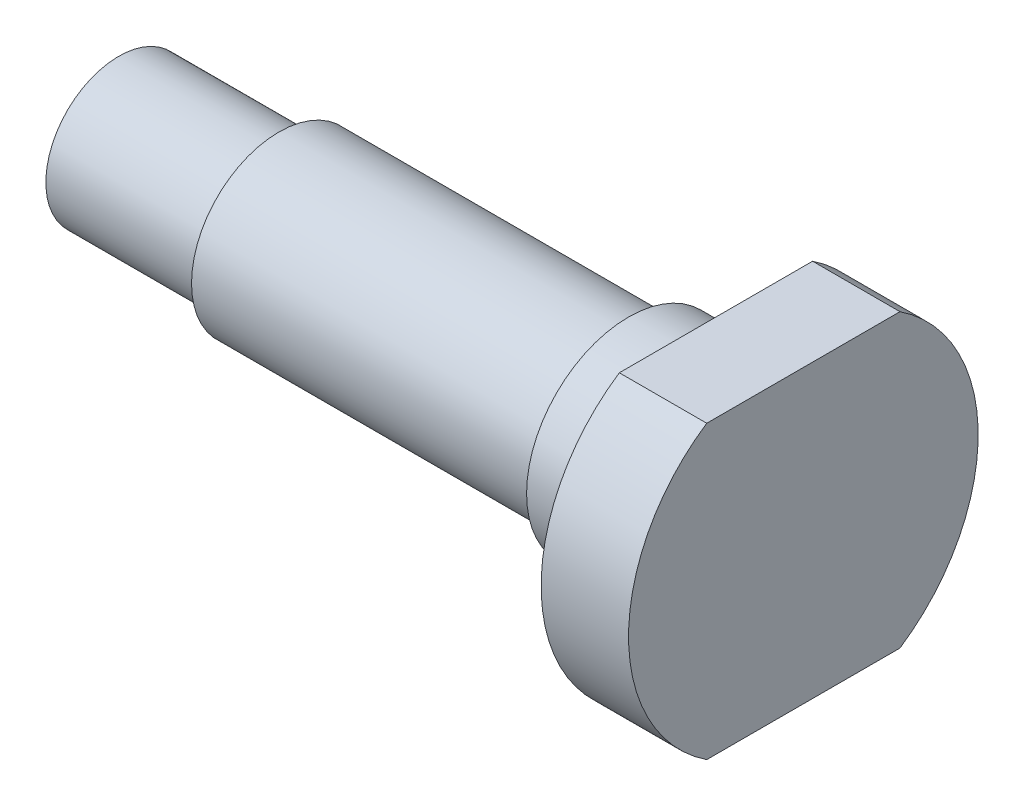
ISO-10303-21;
HEADER;
FILE_DESCRIPTION(('STEP AP214'),'2;1');
FILE_NAME('part.step','',(''),(''),'','','');
FILE_SCHEMA(('AUTOMOTIVE_DESIGN { 1 0 10303 214 1 1 1 1 }'));
ENDSEC;
DATA;
#1=APPLICATION_CONTEXT('core data for automotive mechanical design processes');
#2=APPLICATION_PROTOCOL_DEFINITION('international standard','automotive_design',2000,#1);
#3=PRODUCT_CONTEXT('',#1,'mechanical');
#4=PRODUCT('Part','Part','',(#3));
#5=PRODUCT_RELATED_PRODUCT_CATEGORY('part','',(#4));
#6=PRODUCT_DEFINITION_FORMATION('','',#4);
#7=PRODUCT_DEFINITION_CONTEXT('part definition',#1,'design');
#8=PRODUCT_DEFINITION('design','',#6,#7);
#9=PRODUCT_DEFINITION_SHAPE('','',#8);
#10=(LENGTH_UNIT() NAMED_UNIT(*) SI_UNIT(.MILLI.,.METRE.));
#11=(NAMED_UNIT(*) PLANE_ANGLE_UNIT() SI_UNIT($,.RADIAN.));
#12=(NAMED_UNIT(*) SI_UNIT($,.STERADIAN.) SOLID_ANGLE_UNIT());
#13=UNCERTAINTY_MEASURE_WITH_UNIT(LENGTH_MEASURE(1.E-05),#10,'distance_accuracy_value','');
#14=(GEOMETRIC_REPRESENTATION_CONTEXT(3) GLOBAL_UNCERTAINTY_ASSIGNED_CONTEXT((#13)) GLOBAL_UNIT_ASSIGNED_CONTEXT((#10,
#11,#12)) REPRESENTATION_CONTEXT('',''));
#15=CARTESIAN_POINT('',(0.,0.,0.));
#16=DIRECTION('',(0.,0.,1.));
#17=DIRECTION('',(1.,0.,0.));
#18=AXIS2_PLACEMENT_3D('',#15,#16,#17);
#19=CARTESIAN_POINT('',(-15.,0.,0.));
#20=DIRECTION('',(1.,0.,0.));
#21=DIRECTION('',(0.,0.,-1.));
#22=AXIS2_PLACEMENT_3D('',#19,#20,#21);
#23=CYLINDRICAL_SURFACE('',#22,3.);
#24=CARTESIAN_POINT('',(-15.,0.,0.));
#25=DIRECTION('',(1.,0.,0.));
#26=DIRECTION('',(0.,0.,-1.));
#27=AXIS2_PLACEMENT_3D('',#24,#25,#26);
#28=CIRCLE('',#27,3.);
#29=CARTESIAN_POINT('',(-15.,0.,-3.));
#30=VERTEX_POINT('',#29);
#31=EDGE_CURVE('E105',#30,#30,#28,.T.);
#32=ORIENTED_EDGE('',*,*,#31,.T.);
#33=EDGE_LOOP('',(#32));
#34=FACE_BOUND('',#33,.T.);
#35=CARTESIAN_POINT('',(-3.,0.,0.));
#36=DIRECTION('',(1.,0.,0.));
#37=DIRECTION('',(0.,0.,-1.));
#38=AXIS2_PLACEMENT_3D('',#35,#36,#37);
#39=CIRCLE('',#38,3.);
#40=CARTESIAN_POINT('',(-3.,0.,-3.));
#41=VERTEX_POINT('',#40);
#42=EDGE_CURVE('E176',#41,#41,#39,.T.);
#43=ORIENTED_EDGE('',*,*,#42,.F.);
#44=EDGE_LOOP('',(#43));
#45=FACE_BOUND('',#44,.T.);
#46=ADVANCED_FACE('F39',(#34,#45),#23,.T.);
#47=CARTESIAN_POINT('',(-15.,0.,0.));
#48=DIRECTION('',(1.,0.,0.));
#49=DIRECTION('',(0.,0.,-1.));
#50=AXIS2_PLACEMENT_3D('',#47,#48,#49);
#51=PLANE('',#50);
#52=CARTESIAN_POINT('',(-15.,0.,0.));
#53=DIRECTION('',(1.,0.,0.));
#54=DIRECTION('',(0.,0.,-1.));
#55=AXIS2_PLACEMENT_3D('',#52,#53,#54);
#56=CIRCLE('',#55,2.5);
#57=CARTESIAN_POINT('',(-15.,0.,-2.5));
#58=VERTEX_POINT('',#57);
#59=EDGE_CURVE('E168',#58,#58,#56,.T.);
#60=ORIENTED_EDGE('',*,*,#59,.T.);
#61=EDGE_LOOP('',(#60));
#62=FACE_BOUND('',#61,.T.);
#63=ORIENTED_EDGE('',*,*,#31,.F.);
#64=EDGE_LOOP('',(#63));
#65=FACE_BOUND('',#64,.T.);
#66=ADVANCED_FACE('F126',(#62,#65),#51,.F.);
#67=CARTESIAN_POINT('',(-20.5,0.,0.));
#68=DIRECTION('',(1.,0.,0.));
#69=DIRECTION('',(0.,0.,-1.));
#70=AXIS2_PLACEMENT_3D('',#67,#68,#69);
#71=CYLINDRICAL_SURFACE('',#70,2.5);
#72=CARTESIAN_POINT('',(-20.5,0.,0.));
#73=DIRECTION('',(1.,0.,0.));
#74=DIRECTION('',(0.,0.,-1.));
#75=AXIS2_PLACEMENT_3D('',#72,#73,#74);
#76=CIRCLE('',#75,2.5);
#77=CARTESIAN_POINT('',(-20.5,0.,-2.5));
#78=VERTEX_POINT('',#77);
#79=EDGE_CURVE('E165',#78,#78,#76,.T.);
#80=ORIENTED_EDGE('',*,*,#79,.T.);
#81=EDGE_LOOP('',(#80));
#82=FACE_BOUND('',#81,.T.);
#83=ORIENTED_EDGE('',*,*,#59,.F.);
#84=EDGE_LOOP('',(#83));
#85=FACE_BOUND('',#84,.T.);
#86=ADVANCED_FACE('F132',(#82,#85),#71,.T.);
#87=CARTESIAN_POINT('',(-20.5,0.,0.));
#88=DIRECTION('',(1.,0.,0.));
#89=DIRECTION('',(0.,0.,-1.));
#90=AXIS2_PLACEMENT_3D('',#87,#88,#89);
#91=PLANE('',#90);
#92=ORIENTED_EDGE('',*,*,#79,.F.);
#93=EDGE_LOOP('',(#92));
#94=FACE_BOUND('',#93,.T.);
#95=ADVANCED_FACE('F150',(#94),#91,.F.);
#96=CARTESIAN_POINT('',(-3.,0.,0.));
#97=DIRECTION('',(1.,0.,0.));
#98=DIRECTION('',(0.,0.,-1.));
#99=AXIS2_PLACEMENT_3D('',#96,#97,#98);
#100=CYLINDRICAL_SURFACE('',#99,3.5);
#101=CARTESIAN_POINT('',(-3.,0.,0.));
#102=DIRECTION('',(1.,0.,0.));
#103=DIRECTION('',(0.,0.,-1.));
#104=AXIS2_PLACEMENT_3D('',#101,#102,#103);
#105=CIRCLE('',#104,3.5);
#106=CARTESIAN_POINT('',(-3.,0.,-3.5));
#107=VERTEX_POINT('',#106);
#108=EDGE_CURVE('E171',#107,#107,#105,.T.);
#109=ORIENTED_EDGE('',*,*,#108,.T.);
#110=EDGE_LOOP('',(#109));
#111=FACE_BOUND('',#110,.T.);
#112=CARTESIAN_POINT('',(0.,0.,0.));
#113=DIRECTION('',(1.,0.,0.));
#114=DIRECTION('',(0.,0.,-1.));
#115=AXIS2_PLACEMENT_3D('',#112,#113,#114);
#116=CIRCLE('',#115,3.5);
#117=CARTESIAN_POINT('',(0.,0.,-3.5));
#118=VERTEX_POINT('',#117);
#119=EDGE_CURVE('E174',#118,#118,#116,.T.);
#120=ORIENTED_EDGE('',*,*,#119,.F.);
#121=EDGE_LOOP('',(#120));
#122=FACE_BOUND('',#121,.T.);
#123=ADVANCED_FACE('F144',(#111,#122),#100,.T.);
#124=CARTESIAN_POINT('',(-3.,0.,0.));
#125=DIRECTION('',(1.,0.,0.));
#126=DIRECTION('',(0.,0.,-1.));
#127=AXIS2_PLACEMENT_3D('',#124,#125,#126);
#128=PLANE('',#127);
#129=ORIENTED_EDGE('',*,*,#42,.T.);
#130=EDGE_LOOP('',(#129));
#131=FACE_BOUND('',#130,.T.);
#132=ORIENTED_EDGE('',*,*,#108,.F.);
#133=EDGE_LOOP('',(#132));
#134=FACE_BOUND('',#133,.T.);
#135=ADVANCED_FACE('F139',(#131,#134),#128,.F.);
#136=CARTESIAN_POINT('',(3.,0.,0.));
#137=DIRECTION('',(1.,0.,0.));
#138=DIRECTION('',(0.,0.,-1.));
#139=AXIS2_PLACEMENT_3D('',#136,#137,#138);
#140=PLANE('',#139);
#141=DIRECTION('',(0.,0.,-1.));
#142=VECTOR('',#141,1.);
#143=CARTESIAN_POINT('',(3.,-5.,0.));
#144=LINE('',#143,#142);
#145=CARTESIAN_POINT('',(3.,-5.,3.3166247903554));
#146=VERTEX_POINT('',#145);
#147=CARTESIAN_POINT('',(3.,-5.,-3.3166247903554));
#148=VERTEX_POINT('',#147);
#149=EDGE_CURVE('E87',#146,#148,#144,.T.);
#150=ORIENTED_EDGE('',*,*,#149,.T.);
#151=CARTESIAN_POINT('',(3.,0.,0.));
#152=DIRECTION('',(1.,0.,0.));
#153=DIRECTION('',(0.,0.,-1.));
#154=AXIS2_PLACEMENT_3D('',#151,#152,#153);
#155=CIRCLE('',#154,6.);
#156=CARTESIAN_POINT('',(3.,5.,-3.3166247903554));
#157=VERTEX_POINT('',#156);
#158=EDGE_CURVE('E82',#148,#157,#155,.T.);
#159=ORIENTED_EDGE('',*,*,#158,.T.);
#160=DIRECTION('',(0.,0.,-1.));
#161=VECTOR('',#160,1.);
#162=CARTESIAN_POINT('',(3.,5.,0.));
#163=LINE('',#162,#161);
#164=CARTESIAN_POINT('',(3.,5.,3.3166247903554));
#165=VERTEX_POINT('',#164);
#166=EDGE_CURVE('E85',#165,#157,#163,.T.);
#167=ORIENTED_EDGE('',*,*,#166,.F.);
#168=CARTESIAN_POINT('',(3.,0.,0.));
#169=DIRECTION('',(1.,0.,0.));
#170=DIRECTION('',(0.,0.,-1.));
#171=AXIS2_PLACEMENT_3D('',#168,#169,#170);
#172=CIRCLE('',#171,6.);
#173=EDGE_CURVE('E56',#165,#146,#172,.T.);
#174=ORIENTED_EDGE('',*,*,#173,.T.);
#175=EDGE_LOOP('',(#150,#159,#167,#174));
#176=FACE_BOUND('',#175,.T.);
#177=ADVANCED_FACE('F83',(#176),#140,.T.);
#178=CARTESIAN_POINT('',(3.,0.,0.));
#179=DIRECTION('',(-1.,0.,0.));
#180=DIRECTION('',(0.,0.,1.));
#181=AXIS2_PLACEMENT_3D('',#178,#179,#180);
#182=CYLINDRICAL_SURFACE('',#181,6.);
#183=CARTESIAN_POINT('',(0.,0.,0.));
#184=DIRECTION('',(1.,0.,0.));
#185=DIRECTION('',(0.,0.,-1.));
#186=AXIS2_PLACEMENT_3D('',#183,#184,#185);
#187=CIRCLE('',#186,6.);
#188=CARTESIAN_POINT('',(0.,-5.,-3.3166247903554));
#189=VERTEX_POINT('',#188);
#190=CARTESIAN_POINT('',(0.,5.,-3.3166247903554));
#191=VERTEX_POINT('',#190);
#192=EDGE_CURVE('E92',#189,#191,#187,.T.);
#193=ORIENTED_EDGE('',*,*,#192,.T.);
#194=DIRECTION('',(-1.,0.,0.));
#195=VECTOR('',#194,1.);
#196=CARTESIAN_POINT('',(3.,5.,-3.3166247903554));
#197=LINE('',#196,#195);
#198=EDGE_CURVE('E48',#157,#191,#197,.T.);
#199=ORIENTED_EDGE('',*,*,#198,.F.);
#200=ORIENTED_EDGE('',*,*,#158,.F.);
#201=DIRECTION('',(-1.,0.,0.));
#202=VECTOR('',#201,1.);
#203=CARTESIAN_POINT('',(3.,-5.,-3.3166247903554));
#204=LINE('',#203,#202);
#205=EDGE_CURVE('E11',#148,#189,#204,.T.);
#206=ORIENTED_EDGE('',*,*,#205,.T.);
#207=EDGE_LOOP('',(#193,#199,#200,#206));
#208=FACE_BOUND('',#207,.T.);
#209=ADVANCED_FACE('F91',(#208),#182,.T.);
#210=CARTESIAN_POINT('',(3.,5.,0.));
#211=DIRECTION('',(0.,1.,0.));
#212=DIRECTION('',(0.,0.,1.));
#213=AXIS2_PLACEMENT_3D('',#210,#211,#212);
#214=PLANE('',#213);
#215=DIRECTION('',(0.,0.,-1.));
#216=VECTOR('',#215,1.);
#217=CARTESIAN_POINT('',(0.,5.,0.));
#218=LINE('',#217,#216);
#219=CARTESIAN_POINT('',(0.,5.,3.3166247903554));
#220=VERTEX_POINT('',#219);
#221=EDGE_CURVE('E107',#220,#191,#218,.T.);
#222=ORIENTED_EDGE('',*,*,#221,.F.);
#223=DIRECTION('',(-1.,0.,0.));
#224=VECTOR('',#223,1.);
#225=CARTESIAN_POINT('',(3.,5.,3.3166247903554));
#226=LINE('',#225,#224);
#227=EDGE_CURVE('E72',#165,#220,#226,.T.);
#228=ORIENTED_EDGE('',*,*,#227,.F.);
#229=ORIENTED_EDGE('',*,*,#166,.T.);
#230=ORIENTED_EDGE('',*,*,#198,.T.);
#231=EDGE_LOOP('',(#222,#228,#229,#230));
#232=FACE_BOUND('',#231,.T.);
#233=ADVANCED_FACE('F96',(#232),#214,.T.);
#234=CARTESIAN_POINT('',(3.,0.,0.));
#235=DIRECTION('',(-1.,0.,0.));
#236=DIRECTION('',(0.,0.,1.));
#237=AXIS2_PLACEMENT_3D('',#234,#235,#236);
#238=CYLINDRICAL_SURFACE('',#237,6.);
#239=CARTESIAN_POINT('',(0.,0.,0.));
#240=DIRECTION('',(1.,0.,0.));
#241=DIRECTION('',(0.,0.,-1.));
#242=AXIS2_PLACEMENT_3D('',#239,#240,#241);
#243=CIRCLE('',#242,6.);
#244=CARTESIAN_POINT('',(0.,-5.,3.3166247903554));
#245=VERTEX_POINT('',#244);
#246=EDGE_CURVE('E75',#220,#245,#243,.T.);
#247=ORIENTED_EDGE('',*,*,#246,.T.);
#248=DIRECTION('',(-1.,0.,0.));
#249=VECTOR('',#248,1.);
#250=CARTESIAN_POINT('',(3.,-5.,3.3166247903554));
#251=LINE('',#250,#249);
#252=EDGE_CURVE('E98',#146,#245,#251,.T.);
#253=ORIENTED_EDGE('',*,*,#252,.F.);
#254=ORIENTED_EDGE('',*,*,#173,.F.);
#255=ORIENTED_EDGE('',*,*,#227,.T.);
#256=EDGE_LOOP('',(#247,#253,#254,#255));
#257=FACE_BOUND('',#256,.T.);
#258=ADVANCED_FACE('F121',(#257),#238,.T.);
#259=CARTESIAN_POINT('',(3.,-5.,0.));
#260=DIRECTION('',(0.,1.,0.));
#261=DIRECTION('',(0.,0.,1.));
#262=AXIS2_PLACEMENT_3D('',#259,#260,#261);
#263=PLANE('',#262);
#264=DIRECTION('',(0.,0.,-1.));
#265=VECTOR('',#264,1.);
#266=CARTESIAN_POINT('',(0.,-5.,0.));
#267=LINE('',#266,#265);
#268=EDGE_CURVE('E102',#245,#189,#267,.T.);
#269=ORIENTED_EDGE('',*,*,#268,.T.);
#270=ORIENTED_EDGE('',*,*,#205,.F.);
#271=ORIENTED_EDGE('',*,*,#149,.F.);
#272=ORIENTED_EDGE('',*,*,#252,.T.);
#273=EDGE_LOOP('',(#269,#270,#271,#272));
#274=FACE_BOUND('',#273,.T.);
#275=ADVANCED_FACE('F41',(#274),#263,.F.);
#276=CARTESIAN_POINT('',(0.,0.,0.));
#277=DIRECTION('',(1.,0.,0.));
#278=DIRECTION('',(0.,0.,-1.));
#279=AXIS2_PLACEMENT_3D('',#276,#277,#278);
#280=PLANE('',#279);
#281=ORIENTED_EDGE('',*,*,#119,.T.);
#282=EDGE_LOOP('',(#281));
#283=FACE_BOUND('',#282,.T.);
#284=ORIENTED_EDGE('',*,*,#268,.F.);
#285=ORIENTED_EDGE('',*,*,#246,.F.);
#286=ORIENTED_EDGE('',*,*,#221,.T.);
#287=ORIENTED_EDGE('',*,*,#192,.F.);
#288=EDGE_LOOP('',(#284,#285,#286,#287));
#289=FACE_BOUND('',#288,.T.);
#290=ADVANCED_FACE('F114',(#283,#289),#280,.F.);
#291=CLOSED_SHELL('',(#46,#66,#86,#95,#123,#135,#177,#209,#233,#258,#275,#290));
#292=MANIFOLD_SOLID_BREP('B2',#291);
#293=ADVANCED_BREP_SHAPE_REPRESENTATION('',(#18,#292),#14);
#294=SHAPE_DEFINITION_REPRESENTATION(#9,#293);
ENDSEC;
END-ISO-10303-21;
